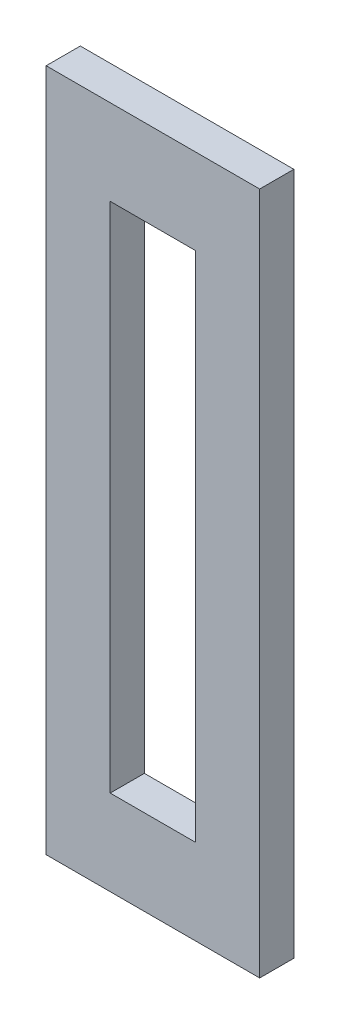
ISO-10303-21;
HEADER;
FILE_DESCRIPTION(('STEP AP214'),'2;1');
FILE_NAME('part.step','',(''),(''),'','','');
FILE_SCHEMA(('AUTOMOTIVE_DESIGN { 1 0 10303 214 1 1 1 1 }'));
ENDSEC;
DATA;
#1=APPLICATION_CONTEXT('core data for automotive mechanical design processes');
#2=APPLICATION_PROTOCOL_DEFINITION('international standard','automotive_design',2000,#1);
#3=PRODUCT_CONTEXT('',#1,'mechanical');
#4=PRODUCT('Part','Part','',(#3));
#5=PRODUCT_RELATED_PRODUCT_CATEGORY('part','',(#4));
#6=PRODUCT_DEFINITION_FORMATION('','',#4);
#7=PRODUCT_DEFINITION_CONTEXT('part definition',#1,'design');
#8=PRODUCT_DEFINITION('design','',#6,#7);
#9=PRODUCT_DEFINITION_SHAPE('','',#8);
#10=(LENGTH_UNIT() NAMED_UNIT(*) SI_UNIT(.MILLI.,.METRE.));
#11=(NAMED_UNIT(*) PLANE_ANGLE_UNIT() SI_UNIT($,.RADIAN.));
#12=(NAMED_UNIT(*) SI_UNIT($,.STERADIAN.) SOLID_ANGLE_UNIT());
#13=UNCERTAINTY_MEASURE_WITH_UNIT(LENGTH_MEASURE(1.E-05),#10,'distance_accuracy_value','');
#14=(GEOMETRIC_REPRESENTATION_CONTEXT(3) GLOBAL_UNCERTAINTY_ASSIGNED_CONTEXT((#13)) GLOBAL_UNIT_ASSIGNED_CONTEXT((#10,
#11,#12)) REPRESENTATION_CONTEXT('',''));
#15=CARTESIAN_POINT('',(0.,0.,0.));
#16=DIRECTION('',(0.,0.,1.));
#17=DIRECTION('',(1.,0.,0.));
#18=AXIS2_PLACEMENT_3D('',#15,#16,#17);
#19=CARTESIAN_POINT('',(0.,0.,4.));
#20=DIRECTION('',(0.,0.,-1.));
#21=DIRECTION('',(-1.,0.,0.));
#22=AXIS2_PLACEMENT_3D('',#19,#20,#21);
#23=PLANE('',#22);
#24=DIRECTION('',(0.,1.,0.));
#25=VECTOR('',#24,1.);
#26=CARTESIAN_POINT('',(12.5,-40.,4.));
#27=LINE('',#26,#25);
#28=CARTESIAN_POINT('',(12.5,-40.,4.));
#29=VERTEX_POINT('',#28);
#30=CARTESIAN_POINT('',(12.5,40.,4.));
#31=VERTEX_POINT('',#30);
#32=EDGE_CURVE('E135',#29,#31,#27,.T.);
#33=ORIENTED_EDGE('',*,*,#32,.T.);
#34=DIRECTION('',(-1.,0.,0.));
#35=VECTOR('',#34,1.);
#36=CARTESIAN_POINT('',(-12.5,40.,4.));
#37=LINE('',#36,#35);
#38=CARTESIAN_POINT('',(-12.5,40.,4.));
#39=VERTEX_POINT('',#38);
#40=EDGE_CURVE('E138',#31,#39,#37,.T.);
#41=ORIENTED_EDGE('',*,*,#40,.T.);
#42=DIRECTION('',(0.,-1.,0.));
#43=VECTOR('',#42,1.);
#44=CARTESIAN_POINT('',(-12.5,-40.,4.));
#45=LINE('',#44,#43);
#46=CARTESIAN_POINT('',(-12.5,-40.,4.));
#47=VERTEX_POINT('',#46);
#48=EDGE_CURVE('E141',#39,#47,#45,.T.);
#49=ORIENTED_EDGE('',*,*,#48,.T.);
#50=DIRECTION('',(1.,0.,0.));
#51=VECTOR('',#50,1.);
#52=CARTESIAN_POINT('',(-12.5,-40.,4.));
#53=LINE('',#52,#51);
#54=EDGE_CURVE('E143',#47,#29,#53,.T.);
#55=ORIENTED_EDGE('',*,*,#54,.T.);
#56=EDGE_LOOP('',(#33,#41,#49,#55));
#57=FACE_BOUND('',#56,.T.);
#58=DIRECTION('',(0.,1.,0.));
#59=VECTOR('',#58,1.);
#60=CARTESIAN_POINT('',(5.,0.,4.));
#61=LINE('',#60,#59);
#62=CARTESIAN_POINT('',(5.,-30.,4.));
#63=VERTEX_POINT('',#62);
#64=CARTESIAN_POINT('',(5.,30.,4.));
#65=VERTEX_POINT('',#64);
#66=EDGE_CURVE('E102',#63,#65,#61,.T.);
#67=ORIENTED_EDGE('',*,*,#66,.F.);
#68=DIRECTION('',(1.,0.,0.));
#69=VECTOR('',#68,1.);
#70=CARTESIAN_POINT('',(0.,-30.,4.));
#71=LINE('',#70,#69);
#72=CARTESIAN_POINT('',(-5.,-30.,4.));
#73=VERTEX_POINT('',#72);
#74=EDGE_CURVE('E105',#73,#63,#71,.T.);
#75=ORIENTED_EDGE('',*,*,#74,.F.);
#76=DIRECTION('',(0.,-1.,0.));
#77=VECTOR('',#76,1.);
#78=CARTESIAN_POINT('',(-5.,0.,4.));
#79=LINE('',#78,#77);
#80=CARTESIAN_POINT('',(-5.,30.,4.));
#81=VERTEX_POINT('',#80);
#82=EDGE_CURVE('E129',#81,#73,#79,.T.);
#83=ORIENTED_EDGE('',*,*,#82,.F.);
#84=DIRECTION('',(-1.,0.,0.));
#85=VECTOR('',#84,1.);
#86=CARTESIAN_POINT('',(0.,30.,4.));
#87=LINE('',#86,#85);
#88=EDGE_CURVE('E131',#65,#81,#87,.T.);
#89=ORIENTED_EDGE('',*,*,#88,.F.);
#90=EDGE_LOOP('',(#67,#75,#83,#89));
#91=FACE_BOUND('',#90,.T.);
#92=ADVANCED_FACE('F34',(#57,#91),#23,.F.);
#93=CARTESIAN_POINT('',(0.,0.,0.));
#94=DIRECTION('',(0.,0.,-1.));
#95=DIRECTION('',(-1.,0.,0.));
#96=AXIS2_PLACEMENT_3D('',#93,#94,#95);
#97=PLANE('',#96);
#98=DIRECTION('',(0.,1.,0.));
#99=VECTOR('',#98,1.);
#100=CARTESIAN_POINT('',(12.5,-40.,0.));
#101=LINE('',#100,#99);
#102=CARTESIAN_POINT('',(12.5,-40.,0.));
#103=VERTEX_POINT('',#102);
#104=CARTESIAN_POINT('',(12.5,40.,0.));
#105=VERTEX_POINT('',#104);
#106=EDGE_CURVE('E134',#103,#105,#101,.T.);
#107=ORIENTED_EDGE('',*,*,#106,.F.);
#108=DIRECTION('',(1.,0.,0.));
#109=VECTOR('',#108,1.);
#110=CARTESIAN_POINT('',(-12.5,-40.,0.));
#111=LINE('',#110,#109);
#112=CARTESIAN_POINT('',(-12.5,-40.,0.));
#113=VERTEX_POINT('',#112);
#114=EDGE_CURVE('E139',#113,#103,#111,.T.);
#115=ORIENTED_EDGE('',*,*,#114,.F.);
#116=DIRECTION('',(0.,-1.,0.));
#117=VECTOR('',#116,1.);
#118=CARTESIAN_POINT('',(-12.5,-40.,0.));
#119=LINE('',#118,#117);
#120=CARTESIAN_POINT('',(-12.5,40.,0.));
#121=VERTEX_POINT('',#120);
#122=EDGE_CURVE('E150',#121,#113,#119,.T.);
#123=ORIENTED_EDGE('',*,*,#122,.F.);
#124=DIRECTION('',(-1.,0.,0.));
#125=VECTOR('',#124,1.);
#126=CARTESIAN_POINT('',(-12.5,40.,0.));
#127=LINE('',#126,#125);
#128=EDGE_CURVE('E148',#105,#121,#127,.T.);
#129=ORIENTED_EDGE('',*,*,#128,.F.);
#130=EDGE_LOOP('',(#107,#115,#123,#129));
#131=FACE_BOUND('',#130,.T.);
#132=DIRECTION('',(1.,0.,0.));
#133=VECTOR('',#132,1.);
#134=CARTESIAN_POINT('',(-5.,-30.,0.));
#135=LINE('',#134,#133);
#136=CARTESIAN_POINT('',(-5.,-30.,0.));
#137=VERTEX_POINT('',#136);
#138=CARTESIAN_POINT('',(5.,-30.,0.));
#139=VERTEX_POINT('',#138);
#140=EDGE_CURVE('E119',#137,#139,#135,.T.);
#141=ORIENTED_EDGE('',*,*,#140,.T.);
#142=DIRECTION('',(0.,1.,0.));
#143=VECTOR('',#142,1.);
#144=CARTESIAN_POINT('',(5.,-30.,0.));
#145=LINE('',#144,#143);
#146=CARTESIAN_POINT('',(5.,30.,0.));
#147=VERTEX_POINT('',#146);
#148=EDGE_CURVE('E57',#139,#147,#145,.T.);
#149=ORIENTED_EDGE('',*,*,#148,.T.);
#150=DIRECTION('',(-1.,0.,0.));
#151=VECTOR('',#150,1.);
#152=CARTESIAN_POINT('',(-5.,30.,0.));
#153=LINE('',#152,#151);
#154=CARTESIAN_POINT('',(-5.,30.,0.));
#155=VERTEX_POINT('',#154);
#156=EDGE_CURVE('E109',#147,#155,#153,.T.);
#157=ORIENTED_EDGE('',*,*,#156,.T.);
#158=DIRECTION('',(0.,-1.,0.));
#159=VECTOR('',#158,1.);
#160=CARTESIAN_POINT('',(-5.,-30.,0.));
#161=LINE('',#160,#159);
#162=EDGE_CURVE('E115',#155,#137,#161,.T.);
#163=ORIENTED_EDGE('',*,*,#162,.T.);
#164=EDGE_LOOP('',(#141,#149,#157,#163));
#165=FACE_BOUND('',#164,.T.);
#166=ADVANCED_FACE('F118',(#131,#165),#97,.T.);
#167=CARTESIAN_POINT('',(12.5,-40.,4.));
#168=DIRECTION('',(-1.,0.,0.));
#169=DIRECTION('',(0.,0.,1.));
#170=AXIS2_PLACEMENT_3D('',#167,#168,#169);
#171=PLANE('',#170);
#172=ORIENTED_EDGE('',*,*,#106,.T.);
#173=DIRECTION('',(0.,0.,-1.));
#174=VECTOR('',#173,1.);
#175=CARTESIAN_POINT('',(12.5,40.,4.));
#176=LINE('',#175,#174);
#177=EDGE_CURVE('E11',#31,#105,#176,.T.);
#178=ORIENTED_EDGE('',*,*,#177,.F.);
#179=ORIENTED_EDGE('',*,*,#32,.F.);
#180=DIRECTION('',(0.,0.,-1.));
#181=VECTOR('',#180,1.);
#182=CARTESIAN_POINT('',(12.5,-40.,4.));
#183=LINE('',#182,#181);
#184=EDGE_CURVE('E145',#29,#103,#183,.T.);
#185=ORIENTED_EDGE('',*,*,#184,.T.);
#186=EDGE_LOOP('',(#172,#178,#179,#185));
#187=FACE_BOUND('',#186,.T.);
#188=ADVANCED_FACE('F36',(#187),#171,.F.);
#189=CARTESIAN_POINT('',(-12.5,40.,4.));
#190=DIRECTION('',(0.,-1.,0.));
#191=DIRECTION('',(0.,0.,-1.));
#192=AXIS2_PLACEMENT_3D('',#189,#190,#191);
#193=PLANE('',#192);
#194=ORIENTED_EDGE('',*,*,#128,.T.);
#195=DIRECTION('',(0.,0.,-1.));
#196=VECTOR('',#195,1.);
#197=CARTESIAN_POINT('',(-12.5,40.,4.));
#198=LINE('',#197,#196);
#199=EDGE_CURVE('E42',#39,#121,#198,.T.);
#200=ORIENTED_EDGE('',*,*,#199,.F.);
#201=ORIENTED_EDGE('',*,*,#40,.F.);
#202=ORIENTED_EDGE('',*,*,#177,.T.);
#203=EDGE_LOOP('',(#194,#200,#201,#202));
#204=FACE_BOUND('',#203,.T.);
#205=ADVANCED_FACE('F177',(#204),#193,.F.);
#206=CARTESIAN_POINT('',(-12.5,-40.,4.));
#207=DIRECTION('',(1.,0.,0.));
#208=DIRECTION('',(0.,0.,-1.));
#209=AXIS2_PLACEMENT_3D('',#206,#207,#208);
#210=PLANE('',#209);
#211=ORIENTED_EDGE('',*,*,#122,.T.);
#212=DIRECTION('',(0.,0.,-1.));
#213=VECTOR('',#212,1.);
#214=CARTESIAN_POINT('',(-12.5,-40.,4.));
#215=LINE('',#214,#213);
#216=EDGE_CURVE('E155',#47,#113,#215,.T.);
#217=ORIENTED_EDGE('',*,*,#216,.F.);
#218=ORIENTED_EDGE('',*,*,#48,.F.);
#219=ORIENTED_EDGE('',*,*,#199,.T.);
#220=EDGE_LOOP('',(#211,#217,#218,#219));
#221=FACE_BOUND('',#220,.T.);
#222=ADVANCED_FACE('F162',(#221),#210,.F.);
#223=CARTESIAN_POINT('',(-12.5,-40.,4.));
#224=DIRECTION('',(0.,1.,0.));
#225=DIRECTION('',(0.,0.,1.));
#226=AXIS2_PLACEMENT_3D('',#223,#224,#225);
#227=PLANE('',#226);
#228=ORIENTED_EDGE('',*,*,#114,.T.);
#229=ORIENTED_EDGE('',*,*,#184,.F.);
#230=ORIENTED_EDGE('',*,*,#54,.F.);
#231=ORIENTED_EDGE('',*,*,#216,.T.);
#232=EDGE_LOOP('',(#228,#229,#230,#231));
#233=FACE_BOUND('',#232,.T.);
#234=ADVANCED_FACE('F170',(#233),#227,.F.);
#235=CARTESIAN_POINT('',(5.,-30.,10.));
#236=DIRECTION('',(-1.,0.,0.));
#237=DIRECTION('',(0.,0.,1.));
#238=AXIS2_PLACEMENT_3D('',#235,#236,#237);
#239=PLANE('',#238);
#240=ORIENTED_EDGE('',*,*,#66,.T.);
#241=DIRECTION('',(0.,0.,-1.));
#242=VECTOR('',#241,1.);
#243=CARTESIAN_POINT('',(5.,30.,10.));
#244=LINE('',#243,#242);
#245=EDGE_CURVE('E98',#65,#147,#244,.T.);
#246=ORIENTED_EDGE('',*,*,#245,.T.);
#247=ORIENTED_EDGE('',*,*,#148,.F.);
#248=DIRECTION('',(0.,0.,-1.));
#249=VECTOR('',#248,1.);
#250=CARTESIAN_POINT('',(5.,-30.,10.));
#251=LINE('',#250,#249);
#252=EDGE_CURVE('E124',#63,#139,#251,.T.);
#253=ORIENTED_EDGE('',*,*,#252,.F.);
#254=EDGE_LOOP('',(#240,#246,#247,#253));
#255=FACE_BOUND('',#254,.T.);
#256=ADVANCED_FACE('F100',(#255),#239,.T.);
#257=CARTESIAN_POINT('',(-5.,30.,10.));
#258=DIRECTION('',(0.,-1.,0.));
#259=DIRECTION('',(0.,0.,-1.));
#260=AXIS2_PLACEMENT_3D('',#257,#258,#259);
#261=PLANE('',#260);
#262=ORIENTED_EDGE('',*,*,#88,.T.);
#263=DIRECTION('',(0.,0.,-1.));
#264=VECTOR('',#263,1.);
#265=CARTESIAN_POINT('',(-5.,30.,10.));
#266=LINE('',#265,#264);
#267=EDGE_CURVE('E106',#81,#155,#266,.T.);
#268=ORIENTED_EDGE('',*,*,#267,.T.);
#269=ORIENTED_EDGE('',*,*,#156,.F.);
#270=ORIENTED_EDGE('',*,*,#245,.F.);
#271=EDGE_LOOP('',(#262,#268,#269,#270));
#272=FACE_BOUND('',#271,.T.);
#273=ADVANCED_FACE('F110',(#272),#261,.T.);
#274=CARTESIAN_POINT('',(-5.,-30.,10.));
#275=DIRECTION('',(1.,0.,0.));
#276=DIRECTION('',(0.,0.,-1.));
#277=AXIS2_PLACEMENT_3D('',#274,#275,#276);
#278=PLANE('',#277);
#279=ORIENTED_EDGE('',*,*,#82,.T.);
#280=DIRECTION('',(0.,0.,-1.));
#281=VECTOR('',#280,1.);
#282=CARTESIAN_POINT('',(-5.,-30.,10.));
#283=LINE('',#282,#281);
#284=EDGE_CURVE('E49',#73,#137,#283,.T.);
#285=ORIENTED_EDGE('',*,*,#284,.T.);
#286=ORIENTED_EDGE('',*,*,#162,.F.);
#287=ORIENTED_EDGE('',*,*,#267,.F.);
#288=EDGE_LOOP('',(#279,#285,#286,#287));
#289=FACE_BOUND('',#288,.T.);
#290=ADVANCED_FACE('F202',(#289),#278,.T.);
#291=CARTESIAN_POINT('',(-5.,-30.,10.));
#292=DIRECTION('',(0.,1.,0.));
#293=DIRECTION('',(0.,0.,1.));
#294=AXIS2_PLACEMENT_3D('',#291,#292,#293);
#295=PLANE('',#294);
#296=ORIENTED_EDGE('',*,*,#74,.T.);
#297=ORIENTED_EDGE('',*,*,#252,.T.);
#298=ORIENTED_EDGE('',*,*,#140,.F.);
#299=ORIENTED_EDGE('',*,*,#284,.F.);
#300=EDGE_LOOP('',(#296,#297,#298,#299));
#301=FACE_BOUND('',#300,.T.);
#302=ADVANCED_FACE('F206',(#301),#295,.T.);
#303=CLOSED_SHELL('',(#92,#166,#188,#205,#222,#234,#256,#273,#290,#302));
#304=MANIFOLD_SOLID_BREP('B2',#303);
#305=ADVANCED_BREP_SHAPE_REPRESENTATION('',(#18,#304),#14);
#306=SHAPE_DEFINITION_REPRESENTATION(#9,#305);
ENDSEC;
END-ISO-10303-21;
